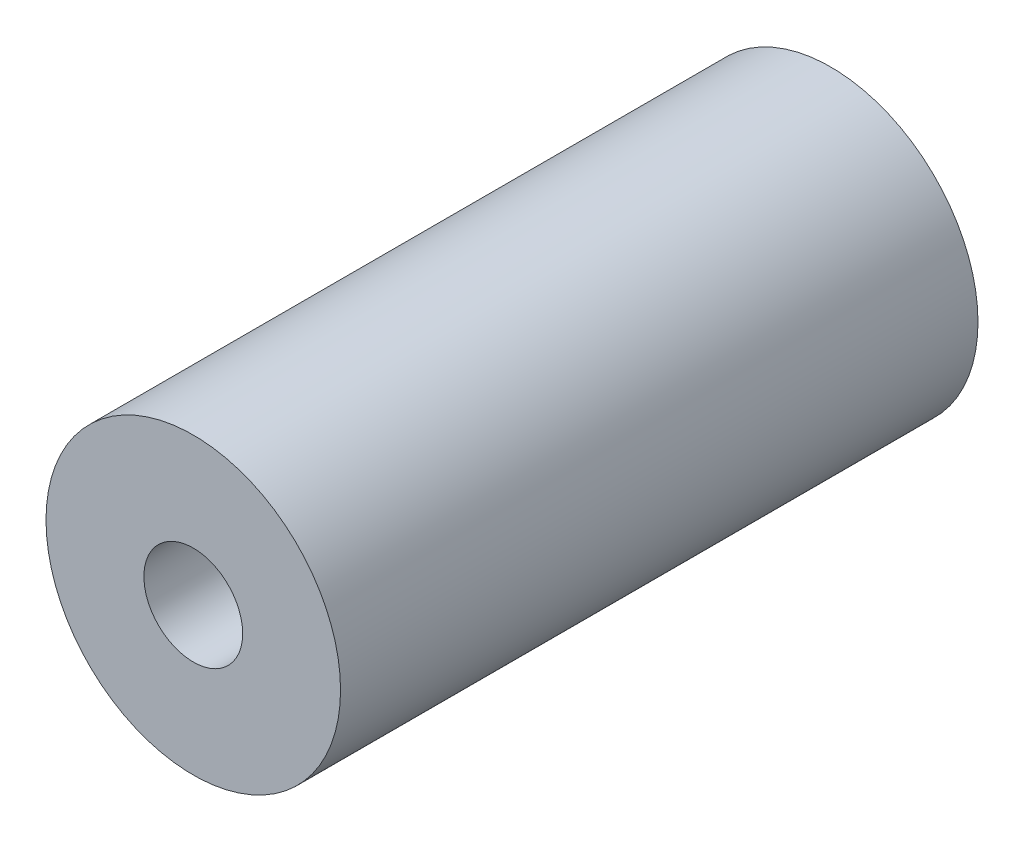
ISO-10303-21;
HEADER;
FILE_DESCRIPTION(('STEP AP214'),'2;1');
FILE_NAME('part.step','',(''),(''),'','','');
FILE_SCHEMA(('AUTOMOTIVE_DESIGN { 1 0 10303 214 1 1 1 1 }'));
ENDSEC;
DATA;
#1=APPLICATION_CONTEXT('core data for automotive mechanical design processes');
#2=APPLICATION_PROTOCOL_DEFINITION('international standard','automotive_design',2000,#1);
#3=PRODUCT_CONTEXT('',#1,'mechanical');
#4=PRODUCT('Part','Part','',(#3));
#5=PRODUCT_RELATED_PRODUCT_CATEGORY('part','',(#4));
#6=PRODUCT_DEFINITION_FORMATION('','',#4);
#7=PRODUCT_DEFINITION_CONTEXT('part definition',#1,'design');
#8=PRODUCT_DEFINITION('design','',#6,#7);
#9=PRODUCT_DEFINITION_SHAPE('','',#8);
#10=(LENGTH_UNIT() NAMED_UNIT(*) SI_UNIT(.MILLI.,.METRE.));
#11=(NAMED_UNIT(*) PLANE_ANGLE_UNIT() SI_UNIT($,.RADIAN.));
#12=(NAMED_UNIT(*) SI_UNIT($,.STERADIAN.) SOLID_ANGLE_UNIT());
#13=UNCERTAINTY_MEASURE_WITH_UNIT(LENGTH_MEASURE(1.E-05),#10,'distance_accuracy_value','');
#14=(GEOMETRIC_REPRESENTATION_CONTEXT(3) GLOBAL_UNCERTAINTY_ASSIGNED_CONTEXT((#13)) GLOBAL_UNIT_ASSIGNED_CONTEXT((#10,
#11,#12)) REPRESENTATION_CONTEXT('',''));
#15=CARTESIAN_POINT('',(0.,0.,0.));
#16=DIRECTION('',(0.,0.,1.));
#17=DIRECTION('',(1.,0.,0.));
#18=AXIS2_PLACEMENT_3D('',#15,#16,#17);
#19=CARTESIAN_POINT('',(0.,0.,60.1012806053458));
#20=DIRECTION('',(0.,0.,-1.));
#21=DIRECTION('',(-1.,0.,0.));
#22=AXIS2_PLACEMENT_3D('',#19,#20,#21);
#23=CYLINDRICAL_SURFACE('',#22,15.875);
#24=CARTESIAN_POINT('',(0.,0.,15.2));
#25=DIRECTION('',(0.,0.,1.));
#26=DIRECTION('',(1.,0.,0.));
#27=AXIS2_PLACEMENT_3D('',#24,#25,#26);
#28=CIRCLE('',#27,15.875);
#29=CARTESIAN_POINT('',(15.875,0.,15.2));
#30=VERTEX_POINT('',#29);
#31=EDGE_CURVE('E43',#30,#30,#28,.T.);
#32=ORIENTED_EDGE('',*,*,#31,.T.);
#33=EDGE_LOOP('',(#32));
#34=FACE_BOUND('',#33,.T.);
#35=CARTESIAN_POINT('',(0.,0.,-15.2));
#36=DIRECTION('',(0.,0.,1.));
#37=DIRECTION('',(1.,0.,0.));
#38=AXIS2_PLACEMENT_3D('',#35,#36,#37);
#39=CIRCLE('',#38,15.875);
#40=CARTESIAN_POINT('',(15.875,0.,-15.2));
#41=VERTEX_POINT('',#40);
#42=EDGE_CURVE('E47',#41,#41,#39,.F.);
#43=ORIENTED_EDGE('',*,*,#42,.T.);
#44=EDGE_LOOP('',(#43));
#45=FACE_BOUND('',#44,.T.);
#46=ADVANCED_FACE('F32',(#34,#45),#23,.F.);
#47=CARTESIAN_POINT('',(0.,0.,15.2));
#48=DIRECTION('',(0.,0.,1.));
#49=DIRECTION('',(1.,0.,0.));
#50=AXIS2_PLACEMENT_3D('',#47,#48,#49);
#51=PLANE('',#50);
#52=CARTESIAN_POINT('',(0.,0.,15.2));
#53=DIRECTION('',(0.,0.,1.));
#54=DIRECTION('',(1.,0.,0.));
#55=AXIS2_PLACEMENT_3D('',#52,#53,#54);
#56=CIRCLE('',#55,5.6);
#57=CARTESIAN_POINT('',(5.6,0.,15.2));
#58=VERTEX_POINT('',#57);
#59=EDGE_CURVE('E55',#58,#58,#56,.F.);
#60=ORIENTED_EDGE('',*,*,#59,.F.);
#61=EDGE_LOOP('',(#60));
#62=FACE_BOUND('',#61,.T.);
#63=ORIENTED_EDGE('',*,*,#31,.F.);
#64=EDGE_LOOP('',(#63));
#65=FACE_BOUND('',#64,.T.);
#66=ADVANCED_FACE('F61',(#62,#65),#51,.F.);
#67=CARTESIAN_POINT('',(0.,0.,-15.2));
#68=DIRECTION('',(0.,0.,1.));
#69=DIRECTION('',(1.,0.,0.));
#70=AXIS2_PLACEMENT_3D('',#67,#68,#69);
#71=PLANE('',#70);
#72=ORIENTED_EDGE('',*,*,#42,.F.);
#73=EDGE_LOOP('',(#72));
#74=FACE_BOUND('',#73,.T.);
#75=ADVANCED_FACE('F64',(#74),#71,.T.);
#76=CARTESIAN_POINT('',(0.,0.,-36.144));
#77=DIRECTION('',(0.,0.,1.));
#78=DIRECTION('',(1.,0.,0.));
#79=AXIS2_PLACEMENT_3D('',#76,#77,#78);
#80=CYLINDRICAL_SURFACE('',#79,5.6);
#81=CARTESIAN_POINT('',(0.,0.,36.143));
#82=DIRECTION('',(0.,0.,1.));
#83=DIRECTION('',(1.,0.,0.));
#84=AXIS2_PLACEMENT_3D('',#81,#82,#83);
#85=CIRCLE('',#84,5.6);
#86=CARTESIAN_POINT('',(5.6,0.,36.143));
#87=VERTEX_POINT('',#86);
#88=EDGE_CURVE('E52',#87,#87,#85,.T.);
#89=ORIENTED_EDGE('',*,*,#88,.T.);
#90=EDGE_LOOP('',(#89));
#91=FACE_BOUND('',#90,.T.);
#92=ORIENTED_EDGE('',*,*,#59,.T.);
#93=EDGE_LOOP('',(#92));
#94=FACE_BOUND('',#93,.T.);
#95=ADVANCED_FACE('F59',(#91,#94),#80,.F.);
#96=CARTESIAN_POINT('',(0.,0.,83.3777329832614));
#97=DIRECTION('',(0.,0.,-1.));
#98=DIRECTION('',(-1.,0.,0.));
#99=AXIS2_PLACEMENT_3D('',#96,#97,#98);
#100=CYLINDRICAL_SURFACE('',#99,16.7);
#101=CARTESIAN_POINT('',(0.,0.,36.143));
#102=DIRECTION('',(0.,0.,1.));
#103=DIRECTION('',(1.,0.,0.));
#104=AXIS2_PLACEMENT_3D('',#101,#102,#103);
#105=CIRCLE('',#104,16.7);
#106=CARTESIAN_POINT('',(16.7,0.,36.143));
#107=VERTEX_POINT('',#106);
#108=EDGE_CURVE('E10',#107,#107,#105,.T.);
#109=ORIENTED_EDGE('',*,*,#108,.F.);
#110=EDGE_LOOP('',(#109));
#111=FACE_BOUND('',#110,.T.);
#112=CARTESIAN_POINT('',(0.,0.,-36.143));
#113=DIRECTION('',(0.,0.,1.));
#114=DIRECTION('',(1.,0.,0.));
#115=AXIS2_PLACEMENT_3D('',#112,#113,#114);
#116=CIRCLE('',#115,16.7);
#117=CARTESIAN_POINT('',(16.7,0.,-36.143));
#118=VERTEX_POINT('',#117);
#119=EDGE_CURVE('E39',#118,#118,#116,.F.);
#120=ORIENTED_EDGE('',*,*,#119,.F.);
#121=EDGE_LOOP('',(#120));
#122=FACE_BOUND('',#121,.T.);
#123=ADVANCED_FACE('F78',(#111,#122),#100,.T.);
#124=CARTESIAN_POINT('',(0.,0.,36.143));
#125=DIRECTION('',(0.,0.,1.));
#126=DIRECTION('',(1.,0.,0.));
#127=AXIS2_PLACEMENT_3D('',#124,#125,#126);
#128=PLANE('',#127);
#129=ORIENTED_EDGE('',*,*,#88,.F.);
#130=EDGE_LOOP('',(#129));
#131=FACE_BOUND('',#130,.T.);
#132=ORIENTED_EDGE('',*,*,#108,.T.);
#133=EDGE_LOOP('',(#132));
#134=FACE_BOUND('',#133,.T.);
#135=ADVANCED_FACE('F34',(#131,#134),#128,.T.);
#136=CARTESIAN_POINT('',(0.,0.,-36.143));
#137=DIRECTION('',(0.,0.,1.));
#138=DIRECTION('',(1.,0.,0.));
#139=AXIS2_PLACEMENT_3D('',#136,#137,#138);
#140=PLANE('',#139);
#141=ORIENTED_EDGE('',*,*,#119,.T.);
#142=EDGE_LOOP('',(#141));
#143=FACE_BOUND('',#142,.T.);
#144=ADVANCED_FACE('F82',(#143),#140,.F.);
#145=CLOSED_SHELL('',(#46,#66,#75,#95,#123,#135,#144));
#146=MANIFOLD_SOLID_BREP('B2',#145);
#147=ADVANCED_BREP_SHAPE_REPRESENTATION('',(#18,#146),#14);
#148=SHAPE_DEFINITION_REPRESENTATION(#9,#147);
ENDSEC;
END-ISO-10303-21;
